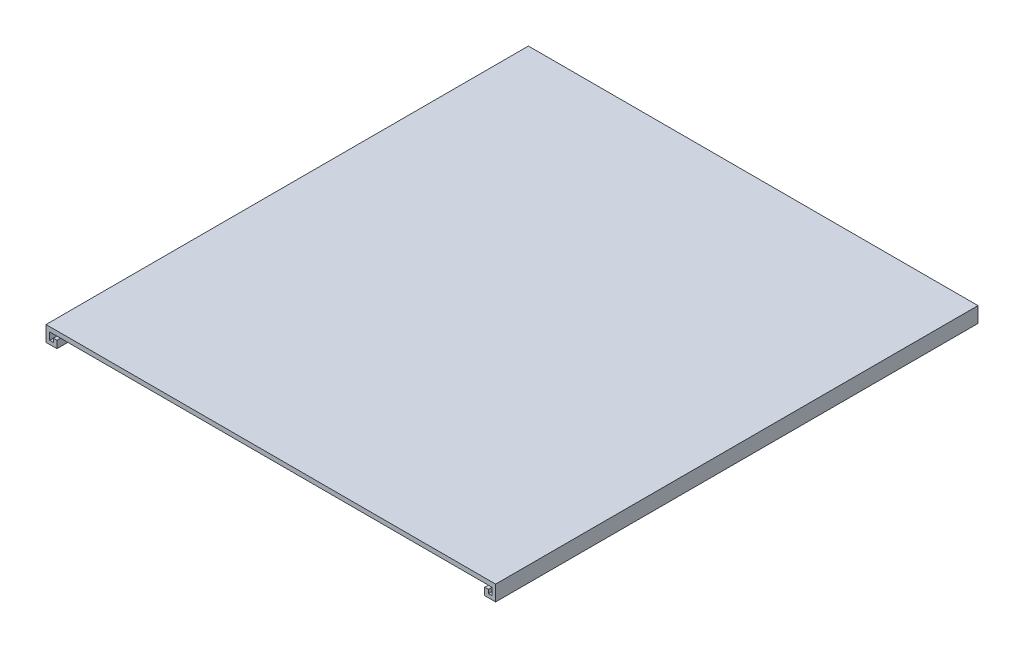
ISO-10303-21;
HEADER;
FILE_DESCRIPTION(('STEP AP214'),'2;1');
FILE_NAME('part.step','',(''),(''),'','','');
FILE_SCHEMA(('AUTOMOTIVE_DESIGN { 1 0 10303 214 1 1 1 1 }'));
ENDSEC;
DATA;
#1=APPLICATION_CONTEXT('core data for automotive mechanical design processes');
#2=APPLICATION_PROTOCOL_DEFINITION('international standard','automotive_design',2000,#1);
#3=PRODUCT_CONTEXT('',#1,'mechanical');
#4=PRODUCT('Part','Part','',(#3));
#5=PRODUCT_RELATED_PRODUCT_CATEGORY('part','',(#4));
#6=PRODUCT_DEFINITION_FORMATION('','',#4);
#7=PRODUCT_DEFINITION_CONTEXT('part definition',#1,'design');
#8=PRODUCT_DEFINITION('design','',#6,#7);
#9=PRODUCT_DEFINITION_SHAPE('','',#8);
#10=(LENGTH_UNIT() NAMED_UNIT(*) SI_UNIT(.MILLI.,.METRE.));
#11=(NAMED_UNIT(*) PLANE_ANGLE_UNIT() SI_UNIT($,.RADIAN.));
#12=(NAMED_UNIT(*) SI_UNIT($,.STERADIAN.) SOLID_ANGLE_UNIT());
#13=UNCERTAINTY_MEASURE_WITH_UNIT(LENGTH_MEASURE(1.E-05),#10,'distance_accuracy_value','');
#14=(GEOMETRIC_REPRESENTATION_CONTEXT(3) GLOBAL_UNCERTAINTY_ASSIGNED_CONTEXT((#13)) GLOBAL_UNIT_ASSIGNED_CONTEXT((#10,
#11,#12)) REPRESENTATION_CONTEXT('',''));
#15=CARTESIAN_POINT('',(0.,0.,0.));
#16=DIRECTION('',(0.,0.,1.));
#17=DIRECTION('',(1.,0.,0.));
#18=AXIS2_PLACEMENT_3D('',#15,#16,#17);
#19=CARTESIAN_POINT('',(-121.5,2.5,132.5));
#20=DIRECTION('',(0.,0.,-1.));
#21=DIRECTION('',(-1.,0.,0.));
#22=AXIS2_PLACEMENT_3D('',#19,#20,#21);
#23=PLANE('',#22);
#24=DIRECTION('',(1.,0.,0.));
#25=VECTOR('',#24,1.);
#26=CARTESIAN_POINT('',(-121.5,0.,132.5));
#27=LINE('',#26,#25);
#28=CARTESIAN_POINT('',(-121.5,0.,132.5));
#29=VERTEX_POINT('',#28);
#30=CARTESIAN_POINT('',(121.5,0.,132.5));
#31=VERTEX_POINT('',#30);
#32=EDGE_CURVE('E324',#29,#31,#27,.T.);
#33=ORIENTED_EDGE('',*,*,#32,.T.);
#34=DIRECTION('',(0.,-1.,0.));
#35=VECTOR('',#34,1.);
#36=CARTESIAN_POINT('',(121.5,2.5,132.5));
#37=LINE('',#36,#35);
#38=CARTESIAN_POINT('',(121.5,-4.,132.5));
#39=VERTEX_POINT('',#38);
#40=EDGE_CURVE('E70',#31,#39,#37,.T.);
#41=ORIENTED_EDGE('',*,*,#40,.T.);
#42=DIRECTION('',(-1.,0.,0.));
#43=VECTOR('',#42,1.);
#44=CARTESIAN_POINT('',(123.5,-4.,132.5));
#45=LINE('',#44,#43);
#46=CARTESIAN_POINT('',(119.5,-4.,132.5));
#47=VERTEX_POINT('',#46);
#48=EDGE_CURVE('E256',#39,#47,#45,.T.);
#49=ORIENTED_EDGE('',*,*,#48,.T.);
#50=DIRECTION('',(0.,-1.,0.));
#51=VECTOR('',#50,1.);
#52=CARTESIAN_POINT('',(119.5,-2.,132.5));
#53=LINE('',#52,#51);
#54=CARTESIAN_POINT('',(119.5,-2.,132.5));
#55=VERTEX_POINT('',#54);
#56=EDGE_CURVE('E228',#55,#47,#53,.T.);
#57=ORIENTED_EDGE('',*,*,#56,.F.);
#58=DIRECTION('',(-1.,0.,0.));
#59=VECTOR('',#58,1.);
#60=CARTESIAN_POINT('',(119.5,-2.,132.5));
#61=LINE('',#60,#59);
#62=CARTESIAN_POINT('',(117.5,-2.,132.5));
#63=VERTEX_POINT('',#62);
#64=EDGE_CURVE('E210',#55,#63,#61,.T.);
#65=ORIENTED_EDGE('',*,*,#64,.T.);
#66=DIRECTION('',(0.,-1.,0.));
#67=VECTOR('',#66,1.);
#68=CARTESIAN_POINT('',(117.5,-2.,132.5));
#69=LINE('',#68,#67);
#70=CARTESIAN_POINT('',(117.5,-6.,132.5));
#71=VERTEX_POINT('',#70);
#72=EDGE_CURVE('E224',#63,#71,#69,.T.);
#73=ORIENTED_EDGE('',*,*,#72,.T.);
#74=DIRECTION('',(-1.,0.,0.));
#75=VECTOR('',#74,1.);
#76=CARTESIAN_POINT('',(123.5,-6.,132.5));
#77=LINE('',#76,#75);
#78=CARTESIAN_POINT('',(123.5,-6.,132.5));
#79=VERTEX_POINT('',#78);
#80=EDGE_CURVE('E259',#79,#71,#77,.T.);
#81=ORIENTED_EDGE('',*,*,#80,.F.);
#82=DIRECTION('',(0.,-1.,0.));
#83=VECTOR('',#82,1.);
#84=CARTESIAN_POINT('',(123.5,2.5,132.5));
#85=LINE('',#84,#83);
#86=CARTESIAN_POINT('',(123.5,2.5,132.5));
#87=VERTEX_POINT('',#86);
#88=EDGE_CURVE('E317',#87,#79,#85,.T.);
#89=ORIENTED_EDGE('',*,*,#88,.F.);
#90=DIRECTION('',(1.,0.,0.));
#91=VECTOR('',#90,1.);
#92=CARTESIAN_POINT('',(-121.5,2.5,132.5));
#93=LINE('',#92,#91);
#94=CARTESIAN_POINT('',(-123.5,2.5,132.5));
#95=VERTEX_POINT('',#94);
#96=EDGE_CURVE('E54',#95,#87,#93,.T.);
#97=ORIENTED_EDGE('',*,*,#96,.F.);
#98=DIRECTION('',(0.,-1.,0.));
#99=VECTOR('',#98,1.);
#100=CARTESIAN_POINT('',(-123.5,2.5,132.5));
#101=LINE('',#100,#99);
#102=CARTESIAN_POINT('',(-123.5,-6.,132.5));
#103=VERTEX_POINT('',#102);
#104=EDGE_CURVE('E289',#95,#103,#101,.T.);
#105=ORIENTED_EDGE('',*,*,#104,.T.);
#106=DIRECTION('',(1.,0.,0.));
#107=VECTOR('',#106,1.);
#108=CARTESIAN_POINT('',(-123.5,-6.,132.5));
#109=LINE('',#108,#107);
#110=CARTESIAN_POINT('',(-117.5,-6.,132.5));
#111=VERTEX_POINT('',#110);
#112=EDGE_CURVE('E270',#103,#111,#109,.T.);
#113=ORIENTED_EDGE('',*,*,#112,.T.);
#114=DIRECTION('',(0.,-1.,0.));
#115=VECTOR('',#114,1.);
#116=CARTESIAN_POINT('',(-117.5,-2.,132.5));
#117=LINE('',#116,#115);
#118=CARTESIAN_POINT('',(-117.5,-2.,132.5));
#119=VERTEX_POINT('',#118);
#120=EDGE_CURVE('E204',#119,#111,#117,.T.);
#121=ORIENTED_EDGE('',*,*,#120,.F.);
#122=DIRECTION('',(-1.,0.,0.));
#123=VECTOR('',#122,1.);
#124=CARTESIAN_POINT('',(-119.5,-2.,132.5));
#125=LINE('',#124,#123);
#126=CARTESIAN_POINT('',(-119.5,-2.,132.5));
#127=VERTEX_POINT('',#126);
#128=EDGE_CURVE('E174',#119,#127,#125,.T.);
#129=ORIENTED_EDGE('',*,*,#128,.T.);
#130=DIRECTION('',(0.,-1.,0.));
#131=VECTOR('',#130,1.);
#132=CARTESIAN_POINT('',(-119.5,-2.,132.5));
#133=LINE('',#132,#131);
#134=CARTESIAN_POINT('',(-119.5,-4.,132.5));
#135=VERTEX_POINT('',#134);
#136=EDGE_CURVE('E189',#127,#135,#133,.T.);
#137=ORIENTED_EDGE('',*,*,#136,.T.);
#138=DIRECTION('',(1.,0.,0.));
#139=VECTOR('',#138,1.);
#140=CARTESIAN_POINT('',(-123.5,-4.,132.5));
#141=LINE('',#140,#139);
#142=CARTESIAN_POINT('',(-121.5,-4.,132.5));
#143=VERTEX_POINT('',#142);
#144=EDGE_CURVE('E271',#143,#135,#141,.T.);
#145=ORIENTED_EDGE('',*,*,#144,.F.);
#146=DIRECTION('',(0.,-1.,0.));
#147=VECTOR('',#146,1.);
#148=CARTESIAN_POINT('',(-121.5,2.5,132.5));
#149=LINE('',#148,#147);
#150=EDGE_CURVE('E290',#29,#143,#149,.T.);
#151=ORIENTED_EDGE('',*,*,#150,.F.);
#152=EDGE_LOOP('',(#33,#41,#49,#57,#65,#73,#81,#89,#97,#105,#113,#121,#129,#137,#145,#151));
#153=FACE_BOUND('',#152,.T.);
#154=ADVANCED_FACE('F45',(#153),#23,.F.);
#155=CARTESIAN_POINT('',(-121.5,2.5,-132.5));
#156=DIRECTION('',(0.,0.,-1.));
#157=DIRECTION('',(-1.,0.,0.));
#158=AXIS2_PLACEMENT_3D('',#155,#156,#157);
#159=PLANE('',#158);
#160=DIRECTION('',(1.,0.,0.));
#161=VECTOR('',#160,1.);
#162=CARTESIAN_POINT('',(-121.5,0.,-132.5));
#163=LINE('',#162,#161);
#164=CARTESIAN_POINT('',(-121.5,0.,-132.5));
#165=VERTEX_POINT('',#164);
#166=CARTESIAN_POINT('',(121.5,0.,-132.5));
#167=VERTEX_POINT('',#166);
#168=EDGE_CURVE('E48',#165,#167,#163,.T.);
#169=ORIENTED_EDGE('',*,*,#168,.F.);
#170=DIRECTION('',(0.,-1.,0.));
#171=VECTOR('',#170,1.);
#172=CARTESIAN_POINT('',(-121.5,2.5,-132.5));
#173=LINE('',#172,#171);
#174=CARTESIAN_POINT('',(-121.5,-4.,-132.5));
#175=VERTEX_POINT('',#174);
#176=EDGE_CURVE('E294',#165,#175,#173,.T.);
#177=ORIENTED_EDGE('',*,*,#176,.T.);
#178=DIRECTION('',(1.,0.,0.));
#179=VECTOR('',#178,1.);
#180=CARTESIAN_POINT('',(-123.5,-4.,-132.5));
#181=LINE('',#180,#179);
#182=CARTESIAN_POINT('',(-119.5,-4.,-132.5));
#183=VERTEX_POINT('',#182);
#184=EDGE_CURVE('E167',#175,#183,#181,.T.);
#185=ORIENTED_EDGE('',*,*,#184,.T.);
#186=DIRECTION('',(0.,-1.,0.));
#187=VECTOR('',#186,1.);
#188=CARTESIAN_POINT('',(-119.5,-2.,-132.5));
#189=LINE('',#188,#187);
#190=CARTESIAN_POINT('',(-119.5,-2.,-132.5));
#191=VERTEX_POINT('',#190);
#192=EDGE_CURVE('E161',#191,#183,#189,.T.);
#193=ORIENTED_EDGE('',*,*,#192,.F.);
#194=DIRECTION('',(1.,0.,0.));
#195=VECTOR('',#194,1.);
#196=CARTESIAN_POINT('',(-119.5,-2.,-132.5));
#197=LINE('',#196,#195);
#198=CARTESIAN_POINT('',(-117.5,-2.,-132.5));
#199=VERTEX_POINT('',#198);
#200=EDGE_CURVE('E165',#191,#199,#197,.T.);
#201=ORIENTED_EDGE('',*,*,#200,.T.);
#202=DIRECTION('',(0.,-1.,0.));
#203=VECTOR('',#202,1.);
#204=CARTESIAN_POINT('',(-117.5,-2.,-132.5));
#205=LINE('',#204,#203);
#206=CARTESIAN_POINT('',(-117.5,-6.,-132.5));
#207=VERTEX_POINT('',#206);
#208=EDGE_CURVE('E173',#199,#207,#205,.T.);
#209=ORIENTED_EDGE('',*,*,#208,.T.);
#210=DIRECTION('',(1.,0.,0.));
#211=VECTOR('',#210,1.);
#212=CARTESIAN_POINT('',(-123.5,-6.,-132.5));
#213=LINE('',#212,#211);
#214=CARTESIAN_POINT('',(-123.5,-6.,-132.5));
#215=VERTEX_POINT('',#214);
#216=EDGE_CURVE('E277',#215,#207,#213,.T.);
#217=ORIENTED_EDGE('',*,*,#216,.F.);
#218=DIRECTION('',(0.,-1.,0.));
#219=VECTOR('',#218,1.);
#220=CARTESIAN_POINT('',(-123.5,2.5,-132.5));
#221=LINE('',#220,#219);
#222=CARTESIAN_POINT('',(-123.5,2.5,-132.5));
#223=VERTEX_POINT('',#222);
#224=EDGE_CURVE('E297',#223,#215,#221,.T.);
#225=ORIENTED_EDGE('',*,*,#224,.F.);
#226=DIRECTION('',(1.,0.,0.));
#227=VECTOR('',#226,1.);
#228=CARTESIAN_POINT('',(-121.5,2.5,-132.5));
#229=LINE('',#228,#227);
#230=CARTESIAN_POINT('',(123.5,2.5,-132.5));
#231=VERTEX_POINT('',#230);
#232=EDGE_CURVE('E11',#223,#231,#229,.T.);
#233=ORIENTED_EDGE('',*,*,#232,.T.);
#234=DIRECTION('',(0.,-1.,0.));
#235=VECTOR('',#234,1.);
#236=CARTESIAN_POINT('',(123.5,2.5,-132.5));
#237=LINE('',#236,#235);
#238=CARTESIAN_POINT('',(123.5,-6.,-132.5));
#239=VERTEX_POINT('',#238);
#240=EDGE_CURVE('E314',#231,#239,#237,.T.);
#241=ORIENTED_EDGE('',*,*,#240,.T.);
#242=DIRECTION('',(-1.,0.,0.));
#243=VECTOR('',#242,1.);
#244=CARTESIAN_POINT('',(123.5,-6.,-132.5));
#245=LINE('',#244,#243);
#246=CARTESIAN_POINT('',(117.5,-6.,-132.5));
#247=VERTEX_POINT('',#246);
#248=EDGE_CURVE('E251',#239,#247,#245,.T.);
#249=ORIENTED_EDGE('',*,*,#248,.T.);
#250=DIRECTION('',(0.,-1.,0.));
#251=VECTOR('',#250,1.);
#252=CARTESIAN_POINT('',(117.5,-2.,-132.5));
#253=LINE('',#252,#251);
#254=CARTESIAN_POINT('',(117.5,-2.,-132.5));
#255=VERTEX_POINT('',#254);
#256=EDGE_CURVE('E237',#255,#247,#253,.T.);
#257=ORIENTED_EDGE('',*,*,#256,.F.);
#258=DIRECTION('',(-1.,0.,0.));
#259=VECTOR('',#258,1.);
#260=CARTESIAN_POINT('',(119.5,-2.,-132.5));
#261=LINE('',#260,#259);
#262=CARTESIAN_POINT('',(119.5,-2.,-132.5));
#263=VERTEX_POINT('',#262);
#264=EDGE_CURVE('E218',#263,#255,#261,.T.);
#265=ORIENTED_EDGE('',*,*,#264,.F.);
#266=DIRECTION('',(0.,-1.,0.));
#267=VECTOR('',#266,1.);
#268=CARTESIAN_POINT('',(119.5,-2.,-132.5));
#269=LINE('',#268,#267);
#270=CARTESIAN_POINT('',(119.5,-4.,-132.5));
#271=VERTEX_POINT('',#270);
#272=EDGE_CURVE('E233',#263,#271,#269,.T.);
#273=ORIENTED_EDGE('',*,*,#272,.T.);
#274=DIRECTION('',(-1.,0.,0.));
#275=VECTOR('',#274,1.);
#276=CARTESIAN_POINT('',(123.5,-4.,-132.5));
#277=LINE('',#276,#275);
#278=CARTESIAN_POINT('',(121.5,-4.,-132.5));
#279=VERTEX_POINT('',#278);
#280=EDGE_CURVE('E252',#279,#271,#277,.T.);
#281=ORIENTED_EDGE('',*,*,#280,.F.);
#282=DIRECTION('',(0.,-1.,0.));
#283=VECTOR('',#282,1.);
#284=CARTESIAN_POINT('',(121.5,2.5,-132.5));
#285=LINE('',#284,#283);
#286=EDGE_CURVE('E310',#167,#279,#285,.T.);
#287=ORIENTED_EDGE('',*,*,#286,.F.);
#288=EDGE_LOOP('',(#169,#177,#185,#193,#201,#209,#217,#225,#233,#241,#249,#257,#265,#273,#281,#287));
#289=FACE_BOUND('',#288,.T.);
#290=ADVANCED_FACE('F163',(#289),#159,.T.);
#291=CARTESIAN_POINT('',(0.,2.5,0.));
#292=DIRECTION('',(0.,1.,0.));
#293=DIRECTION('',(0.,0.,1.));
#294=AXIS2_PLACEMENT_3D('',#291,#292,#293);
#295=PLANE('',#294);
#296=ORIENTED_EDGE('',*,*,#232,.F.);
#297=DIRECTION('',(0.,0.,-1.));
#298=VECTOR('',#297,1.);
#299=CARTESIAN_POINT('',(-123.5,2.5,132.5));
#300=LINE('',#299,#298);
#301=EDGE_CURVE('E285',#95,#223,#300,.T.);
#302=ORIENTED_EDGE('',*,*,#301,.F.);
#303=ORIENTED_EDGE('',*,*,#96,.T.);
#304=DIRECTION('',(0.,0.,-1.));
#305=VECTOR('',#304,1.);
#306=CARTESIAN_POINT('',(123.5,2.5,132.5));
#307=LINE('',#306,#305);
#308=EDGE_CURVE('E304',#87,#231,#307,.T.);
#309=ORIENTED_EDGE('',*,*,#308,.T.);
#310=EDGE_LOOP('',(#296,#302,#303,#309));
#311=FACE_BOUND('',#310,.T.);
#312=ADVANCED_FACE('F356',(#311),#295,.T.);
#313=CARTESIAN_POINT('',(0.,0.,0.));
#314=DIRECTION('',(0.,1.,0.));
#315=DIRECTION('',(0.,0.,1.));
#316=AXIS2_PLACEMENT_3D('',#313,#314,#315);
#317=PLANE('',#316);
#318=DIRECTION('',(0.,0.,1.));
#319=VECTOR('',#318,1.);
#320=CARTESIAN_POINT('',(-121.5,0.,-132.5));
#321=LINE('',#320,#319);
#322=EDGE_CURVE('E62',#165,#29,#321,.T.);
#323=ORIENTED_EDGE('',*,*,#322,.F.);
#324=ORIENTED_EDGE('',*,*,#168,.T.);
#325=DIRECTION('',(0.,0.,1.));
#326=VECTOR('',#325,1.);
#327=CARTESIAN_POINT('',(121.5,0.,-132.5));
#328=LINE('',#327,#326);
#329=EDGE_CURVE('E326',#167,#31,#328,.T.);
#330=ORIENTED_EDGE('',*,*,#329,.T.);
#331=ORIENTED_EDGE('',*,*,#32,.F.);
#332=EDGE_LOOP('',(#323,#324,#330,#331));
#333=FACE_BOUND('',#332,.T.);
#334=ADVANCED_FACE('F330',(#333),#317,.F.);
#335=CARTESIAN_POINT('',(121.5,2.5,132.5));
#336=DIRECTION('',(-1.,0.,0.));
#337=DIRECTION('',(0.,0.,1.));
#338=AXIS2_PLACEMENT_3D('',#335,#336,#337);
#339=PLANE('',#338);
#340=ORIENTED_EDGE('',*,*,#329,.F.);
#341=ORIENTED_EDGE('',*,*,#286,.T.);
#342=DIRECTION('',(0.,0.,-1.));
#343=VECTOR('',#342,1.);
#344=CARTESIAN_POINT('',(121.5,-4.,132.5));
#345=LINE('',#344,#343);
#346=EDGE_CURVE('E293',#39,#279,#345,.T.);
#347=ORIENTED_EDGE('',*,*,#346,.F.);
#348=ORIENTED_EDGE('',*,*,#40,.F.);
#349=EDGE_LOOP('',(#340,#341,#347,#348));
#350=FACE_BOUND('',#349,.T.);
#351=ADVANCED_FACE('F383',(#350),#339,.T.);
#352=CARTESIAN_POINT('',(123.5,2.5,132.5));
#353=DIRECTION('',(-1.,0.,0.));
#354=DIRECTION('',(0.,0.,1.));
#355=AXIS2_PLACEMENT_3D('',#352,#353,#354);
#356=PLANE('',#355);
#357=ORIENTED_EDGE('',*,*,#88,.T.);
#358=DIRECTION('',(0.,0.,1.));
#359=VECTOR('',#358,1.);
#360=CARTESIAN_POINT('',(123.5,-6.,-132.5));
#361=LINE('',#360,#359);
#362=EDGE_CURVE('E247',#239,#79,#361,.T.);
#363=ORIENTED_EDGE('',*,*,#362,.F.);
#364=ORIENTED_EDGE('',*,*,#240,.F.);
#365=ORIENTED_EDGE('',*,*,#308,.F.);
#366=EDGE_LOOP('',(#357,#363,#364,#365));
#367=FACE_BOUND('',#366,.T.);
#368=ADVANCED_FACE('F366',(#367),#356,.F.);
#369=CARTESIAN_POINT('',(-121.5,2.5,132.5));
#370=DIRECTION('',(-1.,0.,0.));
#371=DIRECTION('',(0.,0.,1.));
#372=AXIS2_PLACEMENT_3D('',#369,#370,#371);
#373=PLANE('',#372);
#374=ORIENTED_EDGE('',*,*,#176,.F.);
#375=ORIENTED_EDGE('',*,*,#322,.T.);
#376=ORIENTED_EDGE('',*,*,#150,.T.);
#377=DIRECTION('',(0.,0.,-1.));
#378=VECTOR('',#377,1.);
#379=CARTESIAN_POINT('',(-121.5,-4.,132.5));
#380=LINE('',#379,#378);
#381=EDGE_CURVE('E274',#143,#175,#380,.T.);
#382=ORIENTED_EDGE('',*,*,#381,.T.);
#383=EDGE_LOOP('',(#374,#375,#376,#382));
#384=FACE_BOUND('',#383,.T.);
#385=ADVANCED_FACE('F335',(#384),#373,.F.);
#386=CARTESIAN_POINT('',(-123.5,2.5,132.5));
#387=DIRECTION('',(-1.,0.,0.));
#388=DIRECTION('',(0.,0.,1.));
#389=AXIS2_PLACEMENT_3D('',#386,#387,#388);
#390=PLANE('',#389);
#391=ORIENTED_EDGE('',*,*,#224,.T.);
#392=DIRECTION('',(0.,0.,-1.));
#393=VECTOR('',#392,1.);
#394=CARTESIAN_POINT('',(-123.5,-6.,132.5));
#395=LINE('',#394,#393);
#396=EDGE_CURVE('E266',#103,#215,#395,.T.);
#397=ORIENTED_EDGE('',*,*,#396,.F.);
#398=ORIENTED_EDGE('',*,*,#104,.F.);
#399=ORIENTED_EDGE('',*,*,#301,.T.);
#400=EDGE_LOOP('',(#391,#397,#398,#399));
#401=FACE_BOUND('',#400,.T.);
#402=ADVANCED_FACE('F353',(#401),#390,.T.);
#403=CARTESIAN_POINT('',(-123.5,-4.,132.5));
#404=DIRECTION('',(0.,-1.,0.));
#405=DIRECTION('',(0.,0.,-1.));
#406=AXIS2_PLACEMENT_3D('',#403,#404,#405);
#407=PLANE('',#406);
#408=ORIENTED_EDGE('',*,*,#184,.F.);
#409=ORIENTED_EDGE('',*,*,#381,.F.);
#410=ORIENTED_EDGE('',*,*,#144,.T.);
#411=DIRECTION('',(0.,0.,-1.));
#412=VECTOR('',#411,1.);
#413=CARTESIAN_POINT('',(-119.5,-4.,132.5));
#414=LINE('',#413,#412);
#415=EDGE_CURVE('E255',#135,#183,#414,.T.);
#416=ORIENTED_EDGE('',*,*,#415,.T.);
#417=EDGE_LOOP('',(#408,#409,#410,#416));
#418=FACE_BOUND('',#417,.T.);
#419=ADVANCED_FACE('F340',(#418),#407,.F.);
#420=CARTESIAN_POINT('',(-123.5,-6.,132.5));
#421=DIRECTION('',(0.,-1.,0.));
#422=DIRECTION('',(0.,0.,-1.));
#423=AXIS2_PLACEMENT_3D('',#420,#421,#422);
#424=PLANE('',#423);
#425=ORIENTED_EDGE('',*,*,#216,.T.);
#426=DIRECTION('',(0.,0.,1.));
#427=VECTOR('',#426,1.);
#428=CARTESIAN_POINT('',(-117.5,-6.,132.5));
#429=LINE('',#428,#427);
#430=EDGE_CURVE('E191',#207,#111,#429,.T.);
#431=ORIENTED_EDGE('',*,*,#430,.T.);
#432=ORIENTED_EDGE('',*,*,#112,.F.);
#433=ORIENTED_EDGE('',*,*,#396,.T.);
#434=EDGE_LOOP('',(#425,#431,#432,#433));
#435=FACE_BOUND('',#434,.T.);
#436=ADVANCED_FACE('F350',(#435),#424,.T.);
#437=CARTESIAN_POINT('',(123.5,-4.,-132.5));
#438=DIRECTION('',(0.,-1.,0.));
#439=DIRECTION('',(0.,0.,-1.));
#440=AXIS2_PLACEMENT_3D('',#437,#438,#439);
#441=PLANE('',#440);
#442=ORIENTED_EDGE('',*,*,#346,.T.);
#443=ORIENTED_EDGE('',*,*,#280,.T.);
#444=DIRECTION('',(0.,0.,1.));
#445=VECTOR('',#444,1.);
#446=CARTESIAN_POINT('',(119.5,-4.,-132.5));
#447=LINE('',#446,#445);
#448=EDGE_CURVE('E232',#271,#47,#447,.T.);
#449=ORIENTED_EDGE('',*,*,#448,.T.);
#450=ORIENTED_EDGE('',*,*,#48,.F.);
#451=EDGE_LOOP('',(#442,#443,#449,#450));
#452=FACE_BOUND('',#451,.T.);
#453=ADVANCED_FACE('F382',(#452),#441,.F.);
#454=CARTESIAN_POINT('',(123.5,-6.,-132.5));
#455=DIRECTION('',(0.,-1.,0.));
#456=DIRECTION('',(0.,0.,-1.));
#457=AXIS2_PLACEMENT_3D('',#454,#455,#456);
#458=PLANE('',#457);
#459=ORIENTED_EDGE('',*,*,#80,.T.);
#460=DIRECTION('',(0.,0.,-1.));
#461=VECTOR('',#460,1.);
#462=CARTESIAN_POINT('',(117.5,-6.,132.5));
#463=LINE('',#462,#461);
#464=EDGE_CURVE('E203',#71,#247,#463,.T.);
#465=ORIENTED_EDGE('',*,*,#464,.T.);
#466=ORIENTED_EDGE('',*,*,#248,.F.);
#467=ORIENTED_EDGE('',*,*,#362,.T.);
#468=EDGE_LOOP('',(#459,#465,#466,#467));
#469=FACE_BOUND('',#468,.T.);
#470=ADVANCED_FACE('F364',(#469),#458,.T.);
#471=CARTESIAN_POINT('',(119.5,-2.,132.5));
#472=DIRECTION('',(-1.,0.,0.));
#473=DIRECTION('',(0.,0.,1.));
#474=AXIS2_PLACEMENT_3D('',#471,#472,#473);
#475=PLANE('',#474);
#476=ORIENTED_EDGE('',*,*,#56,.T.);
#477=ORIENTED_EDGE('',*,*,#448,.F.);
#478=ORIENTED_EDGE('',*,*,#272,.F.);
#479=DIRECTION('',(0.,0.,-1.));
#480=VECTOR('',#479,1.);
#481=CARTESIAN_POINT('',(119.5,-2.,132.5));
#482=LINE('',#481,#480);
#483=EDGE_CURVE('E221',#55,#263,#482,.T.);
#484=ORIENTED_EDGE('',*,*,#483,.F.);
#485=EDGE_LOOP('',(#476,#477,#478,#484));
#486=FACE_BOUND('',#485,.T.);
#487=ADVANCED_FACE('F380',(#486),#475,.F.);
#488=CARTESIAN_POINT('',(117.5,-2.,132.5));
#489=DIRECTION('',(-1.,0.,0.));
#490=DIRECTION('',(0.,0.,1.));
#491=AXIS2_PLACEMENT_3D('',#488,#489,#490);
#492=PLANE('',#491);
#493=ORIENTED_EDGE('',*,*,#464,.F.);
#494=ORIENTED_EDGE('',*,*,#72,.F.);
#495=DIRECTION('',(0.,0.,-1.));
#496=VECTOR('',#495,1.);
#497=CARTESIAN_POINT('',(117.5,-2.,132.5));
#498=LINE('',#497,#496);
#499=EDGE_CURVE('E214',#63,#255,#498,.T.);
#500=ORIENTED_EDGE('',*,*,#499,.T.);
#501=ORIENTED_EDGE('',*,*,#256,.T.);
#502=EDGE_LOOP('',(#493,#494,#500,#501));
#503=FACE_BOUND('',#502,.T.);
#504=ADVANCED_FACE('F372',(#503),#492,.T.);
#505=CARTESIAN_POINT('',(0.,-2.,0.));
#506=DIRECTION('',(0.,-1.,0.));
#507=DIRECTION('',(0.,0.,-1.));
#508=AXIS2_PLACEMENT_3D('',#505,#506,#507);
#509=PLANE('',#508);
#510=ORIENTED_EDGE('',*,*,#64,.F.);
#511=ORIENTED_EDGE('',*,*,#483,.T.);
#512=ORIENTED_EDGE('',*,*,#264,.T.);
#513=ORIENTED_EDGE('',*,*,#499,.F.);
#514=EDGE_LOOP('',(#510,#511,#512,#513));
#515=FACE_BOUND('',#514,.T.);
#516=ADVANCED_FACE('F376',(#515),#509,.F.);
#517=CARTESIAN_POINT('',(-119.5,-2.,132.5));
#518=DIRECTION('',(-1.,0.,0.));
#519=DIRECTION('',(0.,0.,1.));
#520=AXIS2_PLACEMENT_3D('',#517,#518,#519);
#521=PLANE('',#520);
#522=ORIENTED_EDGE('',*,*,#415,.F.);
#523=ORIENTED_EDGE('',*,*,#136,.F.);
#524=DIRECTION('',(0.,0.,-1.));
#525=VECTOR('',#524,1.);
#526=CARTESIAN_POINT('',(-119.5,-2.,132.5));
#527=LINE('',#526,#525);
#528=EDGE_CURVE('E181',#127,#191,#527,.T.);
#529=ORIENTED_EDGE('',*,*,#528,.T.);
#530=ORIENTED_EDGE('',*,*,#192,.T.);
#531=EDGE_LOOP('',(#522,#523,#529,#530));
#532=FACE_BOUND('',#531,.T.);
#533=ADVANCED_FACE('F187',(#532),#521,.T.);
#534=CARTESIAN_POINT('',(-117.5,-2.,132.5));
#535=DIRECTION('',(1.,0.,0.));
#536=DIRECTION('',(0.,0.,-1.));
#537=AXIS2_PLACEMENT_3D('',#534,#535,#536);
#538=PLANE('',#537);
#539=ORIENTED_EDGE('',*,*,#430,.F.);
#540=ORIENTED_EDGE('',*,*,#208,.F.);
#541=DIRECTION('',(0.,0.,1.));
#542=VECTOR('',#541,1.);
#543=CARTESIAN_POINT('',(-117.5,-2.,132.5));
#544=LINE('',#543,#542);
#545=EDGE_CURVE('E184',#199,#119,#544,.T.);
#546=ORIENTED_EDGE('',*,*,#545,.T.);
#547=ORIENTED_EDGE('',*,*,#120,.T.);
#548=EDGE_LOOP('',(#539,#540,#546,#547));
#549=FACE_BOUND('',#548,.T.);
#550=ADVANCED_FACE('F345',(#549),#538,.T.);
#551=CARTESIAN_POINT('',(0.,-2.,0.));
#552=DIRECTION('',(0.,-1.,0.));
#553=DIRECTION('',(0.,0.,-1.));
#554=AXIS2_PLACEMENT_3D('',#551,#552,#553);
#555=PLANE('',#554);
#556=ORIENTED_EDGE('',*,*,#528,.F.);
#557=ORIENTED_EDGE('',*,*,#128,.F.);
#558=ORIENTED_EDGE('',*,*,#545,.F.);
#559=ORIENTED_EDGE('',*,*,#200,.F.);
#560=EDGE_LOOP('',(#556,#557,#558,#559));
#561=FACE_BOUND('',#560,.T.);
#562=ADVANCED_FACE('F179',(#561),#555,.F.);
#563=CLOSED_SHELL('',(#154,#290,#312,#334,#351,#368,#385,#402,#419,#436,#453,#470,#487,#504,
#516,#533,#550,#562));
#564=MANIFOLD_SOLID_BREP('B2',#563);
#565=ADVANCED_BREP_SHAPE_REPRESENTATION('',(#18,#564),#14);
#566=SHAPE_DEFINITION_REPRESENTATION(#9,#565);
ENDSEC;
END-ISO-10303-21;
